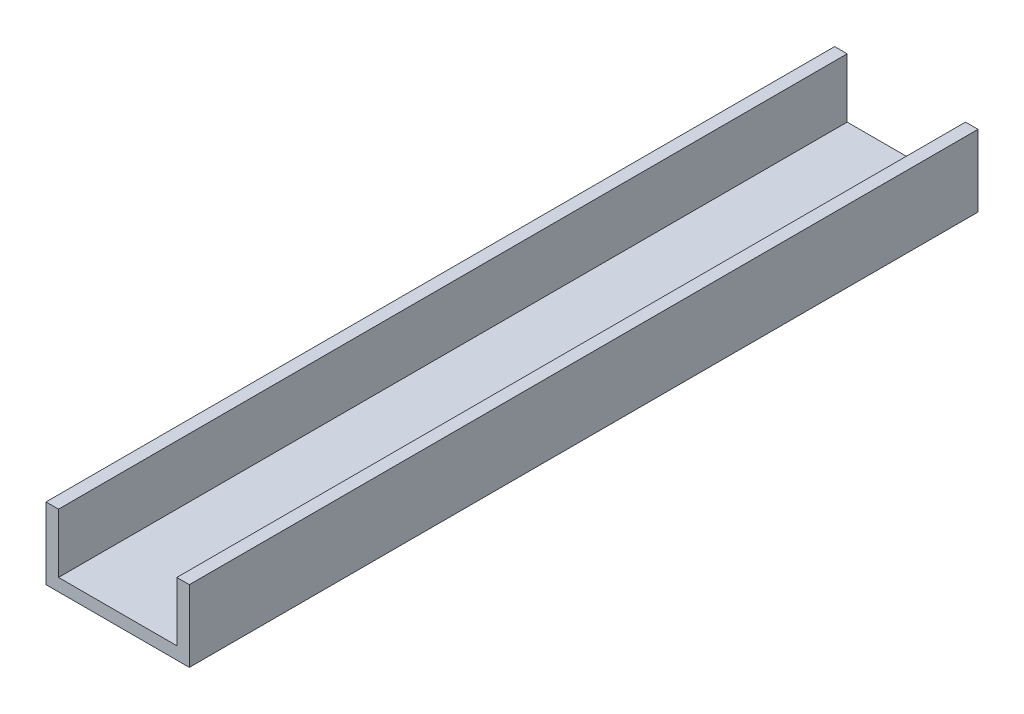
ISO-10303-21;
HEADER;
FILE_DESCRIPTION(('STEP AP214'),'2;1');
FILE_NAME('part.step','',(''),(''),'','','');
FILE_SCHEMA(('AUTOMOTIVE_DESIGN { 1 0 10303 214 1 1 1 1 }'));
ENDSEC;
DATA;
#1=APPLICATION_CONTEXT('core data for automotive mechanical design processes');
#2=APPLICATION_PROTOCOL_DEFINITION('international standard','automotive_design',2000,#1);
#3=PRODUCT_CONTEXT('',#1,'mechanical');
#4=PRODUCT('Part','Part','',(#3));
#5=PRODUCT_RELATED_PRODUCT_CATEGORY('part','',(#4));
#6=PRODUCT_DEFINITION_FORMATION('','',#4);
#7=PRODUCT_DEFINITION_CONTEXT('part definition',#1,'design');
#8=PRODUCT_DEFINITION('design','',#6,#7);
#9=PRODUCT_DEFINITION_SHAPE('','',#8);
#10=(LENGTH_UNIT() NAMED_UNIT(*) SI_UNIT(.MILLI.,.METRE.));
#11=(NAMED_UNIT(*) PLANE_ANGLE_UNIT() SI_UNIT($,.RADIAN.));
#12=(NAMED_UNIT(*) SI_UNIT($,.STERADIAN.) SOLID_ANGLE_UNIT());
#13=UNCERTAINTY_MEASURE_WITH_UNIT(LENGTH_MEASURE(1.E-05),#10,'distance_accuracy_value','');
#14=(GEOMETRIC_REPRESENTATION_CONTEXT(3) GLOBAL_UNCERTAINTY_ASSIGNED_CONTEXT((#13)) GLOBAL_UNIT_ASSIGNED_CONTEXT((#10,
#11,#12)) REPRESENTATION_CONTEXT('',''));
#15=CARTESIAN_POINT('',(0.,0.,0.));
#16=DIRECTION('',(0.,0.,1.));
#17=DIRECTION('',(1.,0.,0.));
#18=AXIS2_PLACEMENT_3D('',#15,#16,#17);
#19=CARTESIAN_POINT('',(36.35,3.17500000000009,0.));
#20=DIRECTION('',(0.,-1.,0.));
#21=DIRECTION('',(0.,0.,-1.));
#22=AXIS2_PLACEMENT_3D('',#19,#20,#21);
#23=PLANE('',#22);
#24=DIRECTION('',(0.,0.,1.));
#25=VECTOR('',#24,1.);
#26=CARTESIAN_POINT('',(33.1750000000001,3.17500000000003,-200.));
#27=LINE('',#26,#25);
#28=CARTESIAN_POINT('',(33.1750000000001,3.17500000000003,-200.));
#29=VERTEX_POINT('',#28);
#30=CARTESIAN_POINT('',(33.175,3.17500000000007,0.));
#31=VERTEX_POINT('',#30);
#32=EDGE_CURVE('E108',#29,#31,#27,.T.);
#33=ORIENTED_EDGE('',*,*,#32,.F.);
#34=DIRECTION('',(-1.,0.,0.));
#35=VECTOR('',#34,1.);
#36=CARTESIAN_POINT('',(36.3500000000002,3.17500000000003,-200.));
#37=LINE('',#36,#35);
#38=CARTESIAN_POINT('',(3.17500000000007,3.17500000000004,-200.));
#39=VERTEX_POINT('',#38);
#40=EDGE_CURVE('E87',#29,#39,#37,.T.);
#41=ORIENTED_EDGE('',*,*,#40,.T.);
#42=DIRECTION('',(0.,0.,-1.));
#43=VECTOR('',#42,1.);
#44=CARTESIAN_POINT('',(3.17500000000007,3.17500000000004,-200.));
#45=LINE('',#44,#43);
#46=CARTESIAN_POINT('',(3.175,3.17500000000007,0.));
#47=VERTEX_POINT('',#46);
#48=EDGE_CURVE('E104',#47,#39,#45,.T.);
#49=ORIENTED_EDGE('',*,*,#48,.F.);
#50=DIRECTION('',(-1.,0.,0.));
#51=VECTOR('',#50,1.);
#52=CARTESIAN_POINT('',(36.35,3.17500000000009,0.));
#53=LINE('',#52,#51);
#54=EDGE_CURVE('E48',#31,#47,#53,.T.);
#55=ORIENTED_EDGE('',*,*,#54,.F.);
#56=EDGE_LOOP('',(#33,#41,#49,#55));
#57=FACE_BOUND('',#56,.T.);
#58=ADVANCED_FACE('F33',(#57),#23,.F.);
#59=CARTESIAN_POINT('',(36.35,0.,0.));
#60=DIRECTION('',(0.,0.,-1.));
#61=DIRECTION('',(-1.,0.,0.));
#62=AXIS2_PLACEMENT_3D('',#59,#60,#61);
#63=PLANE('',#62);
#64=DIRECTION('',(0.,-1.,0.));
#65=VECTOR('',#64,1.);
#66=CARTESIAN_POINT('',(0.,0.,0.));
#67=LINE('',#66,#65);
#68=CARTESIAN_POINT('',(0.,18.175,0.));
#69=VERTEX_POINT('',#68);
#70=CARTESIAN_POINT('',(0.,0.,0.));
#71=VERTEX_POINT('',#70);
#72=EDGE_CURVE('E78',#69,#71,#67,.T.);
#73=ORIENTED_EDGE('',*,*,#72,.T.);
#74=DIRECTION('',(-1.,0.,0.));
#75=VECTOR('',#74,1.);
#76=CARTESIAN_POINT('',(36.35,0.,0.));
#77=LINE('',#76,#75);
#78=CARTESIAN_POINT('',(36.35,0.,0.));
#79=VERTEX_POINT('',#78);
#80=EDGE_CURVE('E11',#79,#71,#77,.T.);
#81=ORIENTED_EDGE('',*,*,#80,.F.);
#82=DIRECTION('',(0.,-1.,0.));
#83=VECTOR('',#82,1.);
#84=CARTESIAN_POINT('',(36.35,0.,0.));
#85=LINE('',#84,#83);
#86=CARTESIAN_POINT('',(36.35,18.1750000000001,0.));
#87=VERTEX_POINT('',#86);
#88=EDGE_CURVE('E92',#87,#79,#85,.T.);
#89=ORIENTED_EDGE('',*,*,#88,.F.);
#90=DIRECTION('',(1.,0.,0.));
#91=VECTOR('',#90,1.);
#92=CARTESIAN_POINT('',(36.35,18.1750000000001,0.));
#93=LINE('',#92,#91);
#94=CARTESIAN_POINT('',(33.175,18.1750000000001,0.));
#95=VERTEX_POINT('',#94);
#96=EDGE_CURVE('E152',#95,#87,#93,.T.);
#97=ORIENTED_EDGE('',*,*,#96,.F.);
#98=DIRECTION('',(0.,-1.,0.));
#99=VECTOR('',#98,1.);
#100=CARTESIAN_POINT('',(33.175,18.1750000000001,0.));
#101=LINE('',#100,#99);
#102=EDGE_CURVE('E150',#95,#31,#101,.T.);
#103=ORIENTED_EDGE('',*,*,#102,.T.);
#104=ORIENTED_EDGE('',*,*,#54,.T.);
#105=DIRECTION('',(0.,-1.,0.));
#106=VECTOR('',#105,1.);
#107=CARTESIAN_POINT('',(3.17499999999998,18.175,0.));
#108=LINE('',#107,#106);
#109=CARTESIAN_POINT('',(3.17499999999998,18.175,0.));
#110=VERTEX_POINT('',#109);
#111=EDGE_CURVE('E119',#110,#47,#108,.T.);
#112=ORIENTED_EDGE('',*,*,#111,.F.);
#113=DIRECTION('',(1.,0.,0.));
#114=VECTOR('',#113,1.);
#115=CARTESIAN_POINT('',(0.,18.175,0.));
#116=LINE('',#115,#114);
#117=EDGE_CURVE('E132',#69,#110,#116,.T.);
#118=ORIENTED_EDGE('',*,*,#117,.F.);
#119=EDGE_LOOP('',(#73,#81,#89,#97,#103,#104,#112,#118));
#120=FACE_BOUND('',#119,.T.);
#121=ADVANCED_FACE('F35',(#120),#63,.F.);
#122=CARTESIAN_POINT('',(36.35,0.,0.));
#123=DIRECTION('',(0.,1.,0.));
#124=DIRECTION('',(0.,0.,1.));
#125=AXIS2_PLACEMENT_3D('',#122,#123,#124);
#126=PLANE('',#125);
#127=DIRECTION('',(0.,0.,-1.));
#128=VECTOR('',#127,1.);
#129=CARTESIAN_POINT('',(0.,0.,0.));
#130=LINE('',#129,#128);
#131=CARTESIAN_POINT('',(0.,0.,-200.));
#132=VERTEX_POINT('',#131);
#133=EDGE_CURVE('E68',#71,#132,#130,.T.);
#134=ORIENTED_EDGE('',*,*,#133,.T.);
#135=DIRECTION('',(-1.,0.,0.));
#136=VECTOR('',#135,1.);
#137=CARTESIAN_POINT('',(36.3500000000002,0.,-200.));
#138=LINE('',#137,#136);
#139=CARTESIAN_POINT('',(36.3500000000002,0.,-200.));
#140=VERTEX_POINT('',#139);
#141=EDGE_CURVE('E41',#140,#132,#138,.T.);
#142=ORIENTED_EDGE('',*,*,#141,.F.);
#143=DIRECTION('',(0.,0.,-1.));
#144=VECTOR('',#143,1.);
#145=CARTESIAN_POINT('',(36.35,0.,0.));
#146=LINE('',#145,#144);
#147=EDGE_CURVE('E57',#79,#140,#146,.T.);
#148=ORIENTED_EDGE('',*,*,#147,.F.);
#149=ORIENTED_EDGE('',*,*,#80,.T.);
#150=EDGE_LOOP('',(#134,#142,#148,#149));
#151=FACE_BOUND('',#150,.T.);
#152=ADVANCED_FACE('F70',(#151),#126,.F.);
#153=CARTESIAN_POINT('',(36.3500000000002,0.,-200.));
#154=DIRECTION('',(0.,0.,1.));
#155=DIRECTION('',(1.,0.,0.));
#156=AXIS2_PLACEMENT_3D('',#153,#154,#155);
#157=PLANE('',#156);
#158=DIRECTION('',(0.,1.,0.));
#159=VECTOR('',#158,1.);
#160=CARTESIAN_POINT('',(0.,0.,-200.));
#161=LINE('',#160,#159);
#162=CARTESIAN_POINT('',(1.11022302462516E-13,18.175,-200.));
#163=VERTEX_POINT('',#162);
#164=EDGE_CURVE('E77',#132,#163,#161,.T.);
#165=ORIENTED_EDGE('',*,*,#164,.T.);
#166=DIRECTION('',(-1.,0.,0.));
#167=VECTOR('',#166,1.);
#168=CARTESIAN_POINT('',(1.11022302462516E-13,18.175,-200.));
#169=LINE('',#168,#167);
#170=CARTESIAN_POINT('',(3.17500000000004,18.175,-200.));
#171=VERTEX_POINT('',#170);
#172=EDGE_CURVE('E122',#171,#163,#169,.T.);
#173=ORIENTED_EDGE('',*,*,#172,.F.);
#174=DIRECTION('',(0.,-1.,0.));
#175=VECTOR('',#174,1.);
#176=CARTESIAN_POINT('',(3.17500000000004,18.175,-200.));
#177=LINE('',#176,#175);
#178=EDGE_CURVE('E118',#171,#39,#177,.T.);
#179=ORIENTED_EDGE('',*,*,#178,.T.);
#180=ORIENTED_EDGE('',*,*,#40,.F.);
#181=DIRECTION('',(0.,-1.,0.));
#182=VECTOR('',#181,1.);
#183=CARTESIAN_POINT('',(33.1750000000001,18.175,-200.));
#184=LINE('',#183,#182);
#185=CARTESIAN_POINT('',(33.1750000000001,18.175,-200.));
#186=VERTEX_POINT('',#185);
#187=EDGE_CURVE('E120',#186,#29,#184,.T.);
#188=ORIENTED_EDGE('',*,*,#187,.F.);
#189=DIRECTION('',(-1.,0.,0.));
#190=VECTOR('',#189,1.);
#191=CARTESIAN_POINT('',(36.3500000000001,18.175,-200.));
#192=LINE('',#191,#190);
#193=CARTESIAN_POINT('',(36.3500000000001,18.175,-200.));
#194=VERTEX_POINT('',#193);
#195=EDGE_CURVE('E160',#194,#186,#192,.T.);
#196=ORIENTED_EDGE('',*,*,#195,.F.);
#197=DIRECTION('',(0.,1.,0.));
#198=VECTOR('',#197,1.);
#199=CARTESIAN_POINT('',(36.3500000000002,0.,-200.));
#200=LINE('',#199,#198);
#201=EDGE_CURVE('E86',#140,#194,#200,.T.);
#202=ORIENTED_EDGE('',*,*,#201,.F.);
#203=ORIENTED_EDGE('',*,*,#141,.T.);
#204=EDGE_LOOP('',(#165,#173,#179,#180,#188,#196,#202,#203));
#205=FACE_BOUND('',#204,.T.);
#206=ADVANCED_FACE('F82',(#205),#157,.F.);
#207=CARTESIAN_POINT('',(36.35,0.,0.));
#208=DIRECTION('',(-1.,0.,0.));
#209=DIRECTION('',(0.,0.,1.));
#210=AXIS2_PLACEMENT_3D('',#207,#208,#209);
#211=PLANE('',#210);
#212=ORIENTED_EDGE('',*,*,#88,.T.);
#213=ORIENTED_EDGE('',*,*,#147,.T.);
#214=ORIENTED_EDGE('',*,*,#201,.T.);
#215=DIRECTION('',(0.,0.,-1.));
#216=VECTOR('',#215,1.);
#217=CARTESIAN_POINT('',(36.3500000000001,18.175,-200.));
#218=LINE('',#217,#216);
#219=EDGE_CURVE('E154',#87,#194,#218,.T.);
#220=ORIENTED_EDGE('',*,*,#219,.F.);
#221=EDGE_LOOP('',(#212,#213,#214,#220));
#222=FACE_BOUND('',#221,.T.);
#223=ADVANCED_FACE('F171',(#222),#211,.F.);
#224=CARTESIAN_POINT('',(0.,0.,0.));
#225=DIRECTION('',(-1.,0.,0.));
#226=DIRECTION('',(0.,0.,1.));
#227=AXIS2_PLACEMENT_3D('',#224,#225,#226);
#228=PLANE('',#227);
#229=ORIENTED_EDGE('',*,*,#72,.F.);
#230=DIRECTION('',(0.,0.,1.));
#231=VECTOR('',#230,1.);
#232=CARTESIAN_POINT('',(1.11022302462516E-13,18.175,-200.));
#233=LINE('',#232,#231);
#234=EDGE_CURVE('E91',#163,#69,#233,.T.);
#235=ORIENTED_EDGE('',*,*,#234,.F.);
#236=ORIENTED_EDGE('',*,*,#164,.F.);
#237=ORIENTED_EDGE('',*,*,#133,.F.);
#238=EDGE_LOOP('',(#229,#235,#236,#237));
#239=FACE_BOUND('',#238,.T.);
#240=ADVANCED_FACE('F89',(#239),#228,.T.);
#241=CARTESIAN_POINT('',(3.17500000000004,18.175,-200.));
#242=DIRECTION('',(-1.,0.,0.));
#243=DIRECTION('',(0.,0.,1.));
#244=AXIS2_PLACEMENT_3D('',#241,#242,#243);
#245=PLANE('',#244);
#246=ORIENTED_EDGE('',*,*,#48,.T.);
#247=ORIENTED_EDGE('',*,*,#178,.F.);
#248=DIRECTION('',(0.,0.,-1.));
#249=VECTOR('',#248,1.);
#250=CARTESIAN_POINT('',(3.17500000000004,18.175,-200.));
#251=LINE('',#250,#249);
#252=EDGE_CURVE('E125',#110,#171,#251,.T.);
#253=ORIENTED_EDGE('',*,*,#252,.F.);
#254=ORIENTED_EDGE('',*,*,#111,.T.);
#255=EDGE_LOOP('',(#246,#247,#253,#254));
#256=FACE_BOUND('',#255,.T.);
#257=ADVANCED_FACE('F115',(#256),#245,.F.);
#258=CARTESIAN_POINT('',(0.,18.175,0.));
#259=DIRECTION('',(0.,1.,0.));
#260=DIRECTION('',(0.,0.,1.));
#261=AXIS2_PLACEMENT_3D('',#258,#259,#260);
#262=PLANE('',#261);
#263=ORIENTED_EDGE('',*,*,#234,.T.);
#264=ORIENTED_EDGE('',*,*,#117,.T.);
#265=ORIENTED_EDGE('',*,*,#252,.T.);
#266=ORIENTED_EDGE('',*,*,#172,.T.);
#267=EDGE_LOOP('',(#263,#264,#265,#266));
#268=FACE_BOUND('',#267,.T.);
#269=ADVANCED_FACE('F143',(#268),#262,.T.);
#270=CARTESIAN_POINT('',(33.1750000000001,18.175,-200.));
#271=DIRECTION('',(1.,0.,0.));
#272=DIRECTION('',(0.,0.,-1.));
#273=AXIS2_PLACEMENT_3D('',#270,#271,#272);
#274=PLANE('',#273);
#275=ORIENTED_EDGE('',*,*,#32,.T.);
#276=ORIENTED_EDGE('',*,*,#102,.F.);
#277=DIRECTION('',(0.,0.,1.));
#278=VECTOR('',#277,1.);
#279=CARTESIAN_POINT('',(33.1750000000001,18.175,-200.));
#280=LINE('',#279,#278);
#281=EDGE_CURVE('E157',#186,#95,#280,.T.);
#282=ORIENTED_EDGE('',*,*,#281,.F.);
#283=ORIENTED_EDGE('',*,*,#187,.T.);
#284=EDGE_LOOP('',(#275,#276,#282,#283));
#285=FACE_BOUND('',#284,.T.);
#286=ADVANCED_FACE('F179',(#285),#274,.F.);
#287=CARTESIAN_POINT('',(0.,18.175,0.));
#288=DIRECTION('',(0.,-1.,0.));
#289=DIRECTION('',(0.,0.,-1.));
#290=AXIS2_PLACEMENT_3D('',#287,#288,#289);
#291=PLANE('',#290);
#292=ORIENTED_EDGE('',*,*,#219,.T.);
#293=ORIENTED_EDGE('',*,*,#195,.T.);
#294=ORIENTED_EDGE('',*,*,#281,.T.);
#295=ORIENTED_EDGE('',*,*,#96,.T.);
#296=EDGE_LOOP('',(#292,#293,#294,#295));
#297=FACE_BOUND('',#296,.T.);
#298=ADVANCED_FACE('F167',(#297),#291,.F.);
#299=CLOSED_SHELL('',(#58,#121,#152,#206,#223,#240,#257,#269,#286,#298));
#300=MANIFOLD_SOLID_BREP('B2',#299);
#301=ADVANCED_BREP_SHAPE_REPRESENTATION('',(#18,#300),#14);
#302=SHAPE_DEFINITION_REPRESENTATION(#9,#301);
ENDSEC;
END-ISO-10303-21;
